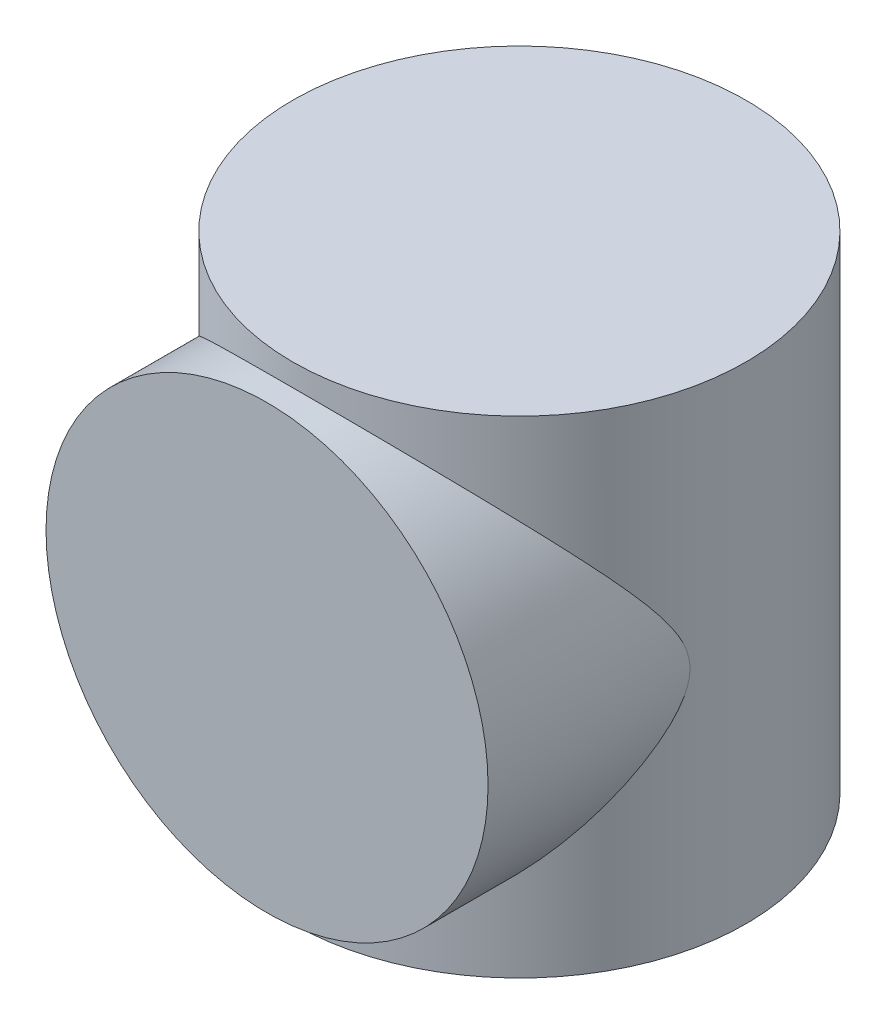
ISO-10303-21;
HEADER;
FILE_DESCRIPTION(('STEP AP214'),'2;1');
FILE_NAME('part.step','',(''),(''),'','','');
FILE_SCHEMA(('AUTOMOTIVE_DESIGN { 1 0 10303 214 1 1 1 1 }'));
ENDSEC;
DATA;
#1=APPLICATION_CONTEXT('core data for automotive mechanical design processes');
#2=APPLICATION_PROTOCOL_DEFINITION('international standard','automotive_design',2000,#1);
#3=PRODUCT_CONTEXT('',#1,'mechanical');
#4=PRODUCT('Part','Part','',(#3));
#5=PRODUCT_RELATED_PRODUCT_CATEGORY('part','',(#4));
#6=PRODUCT_DEFINITION_FORMATION('','',#4);
#7=PRODUCT_DEFINITION_CONTEXT('part definition',#1,'design');
#8=PRODUCT_DEFINITION('design','',#6,#7);
#9=PRODUCT_DEFINITION_SHAPE('','',#8);
#10=(LENGTH_UNIT() NAMED_UNIT(*) SI_UNIT(.MILLI.,.METRE.));
#11=(NAMED_UNIT(*) PLANE_ANGLE_UNIT() SI_UNIT($,.RADIAN.));
#12=(NAMED_UNIT(*) SI_UNIT($,.STERADIAN.) SOLID_ANGLE_UNIT());
#13=UNCERTAINTY_MEASURE_WITH_UNIT(LENGTH_MEASURE(1.E-05),#10,'distance_accuracy_value','');
#14=(GEOMETRIC_REPRESENTATION_CONTEXT(3) GLOBAL_UNCERTAINTY_ASSIGNED_CONTEXT((#13)) GLOBAL_UNIT_ASSIGNED_CONTEXT((#10,
#11,#12)) REPRESENTATION_CONTEXT('',''));
#15=CARTESIAN_POINT('',(0.,0.,0.));
#16=DIRECTION('',(0.,0.,1.));
#17=DIRECTION('',(1.,0.,0.));
#18=AXIS2_PLACEMENT_3D('',#15,#16,#17);
#19=CARTESIAN_POINT('',(0.,115.7,0.));
#20=DIRECTION('',(0.,-1.,0.));
#21=DIRECTION('',(0.,0.,-1.));
#22=AXIS2_PLACEMENT_3D('',#19,#20,#21);
#23=CYLINDRICAL_SURFACE('',#22,53.9);
#24=CARTESIAN_POINT('',(0.,115.7,0.));
#25=DIRECTION('',(0.,1.,0.));
#26=DIRECTION('',(0.,0.,1.));
#27=AXIS2_PLACEMENT_3D('',#24,#25,#26);
#28=CIRCLE('',#27,53.9);
#29=CARTESIAN_POINT('',(0.,115.7,53.9));
#30=VERTEX_POINT('',#29);
#31=EDGE_CURVE('E49',#30,#30,#28,.T.);
#32=ORIENTED_EDGE('',*,*,#31,.F.);
#33=EDGE_LOOP('',(#32));
#34=FACE_BOUND('',#33,.T.);
#35=CARTESIAN_POINT('',(0.,0.,0.));
#36=DIRECTION('',(0.,1.,0.));
#37=DIRECTION('',(0.,0.,1.));
#38=AXIS2_PLACEMENT_3D('',#35,#36,#37);
#39=CIRCLE('',#38,53.9);
#40=CARTESIAN_POINT('',(0.,0.,53.9));
#41=VERTEX_POINT('',#40);
#42=EDGE_CURVE('E54',#41,#41,#39,.T.);
#43=ORIENTED_EDGE('',*,*,#42,.T.);
#44=EDGE_LOOP('',(#43));
#45=FACE_BOUND('',#44,.T.);
#46=CARTESIAN_POINT('',(-52.55,57.85,11.9878063047414));
#47=CARTESIAN_POINT('',(-52.5500013049718,57.4353326704794,11.9877970546293));
#48=CARTESIAN_POINT('',(-52.5450742041005,57.0206930212394,12.0094597837771));
#49=CARTESIAN_POINT('',(-52.5255831345348,56.1959692170633,12.0944188754141));
#50=CARTESIAN_POINT('',(-52.5110181552478,55.7858855444357,12.1577196039075));
#51=CARTESIAN_POINT('',(-52.4726958568226,54.9714634137948,12.3220637154925));
#52=CARTESIAN_POINT('',(-52.4488857718169,54.5671720037319,12.4233236315369));
#53=CARTESIAN_POINT('',(-52.3927990985339,53.7686502685866,12.6577671313837));
#54=CARTESIAN_POINT('',(-52.3605212995449,53.3744213910944,12.7909552800424));
#55=CARTESIAN_POINT('',(-52.2875196252863,52.589173282455,13.0862071888048));
#56=CARTESIAN_POINT('',(-52.2466459621767,52.1983597903172,13.2487746862278));
#57=CARTESIAN_POINT('',(-52.1574702305448,51.4272656061719,13.5956012993441));
#58=CARTESIAN_POINT('',(-52.1091651708133,51.0469892285155,13.7798691426024));
#59=CARTESIAN_POINT('',(-52.0055770514227,50.295766874501,14.1658005041761));
#60=CARTESIAN_POINT('',(-51.9502848447022,49.9248339074463,14.367486713743));
#61=CARTESIAN_POINT('',(-51.8331454731376,49.1917529503745,14.7845216485642));
#62=CARTESIAN_POINT('',(-51.7712970647888,48.829606642974,14.9998729625378));
#63=CARTESIAN_POINT('',(-51.5755906574373,47.7505791747779,15.6646684476805));
#64=CARTESIAN_POINT('',(-51.4321906297022,47.0455251748653,16.1305017808021));
#65=CARTESIAN_POINT('',(-51.1216598545446,45.6606114747183,17.0891874092062));
#66=CARTESIAN_POINT('',(-50.954546934812,44.980733326775,17.5820192372822));
#67=CARTESIAN_POINT('',(-50.655340425748,43.8586630918849,18.422155284591));
#68=CARTESIAN_POINT('',(-50.5295514448285,43.4111311878413,18.7646184440778));
#69=CARTESIAN_POINT('',(-50.2675444883191,42.5238650081251,19.4556046252069));
#70=CARTESIAN_POINT('',(-50.1313262631433,42.0841309193749,19.804127791719));
#71=CARTESIAN_POINT('',(-49.7070547013632,40.7750574014817,20.8564193406821));
#72=CARTESIAN_POINT('',(-49.4034296684526,39.9160152770378,21.5667817031769));
#73=CARTESIAN_POINT('',(-48.7543322110036,38.2198557885142,22.9965864983582));
#74=CARTESIAN_POINT('',(-48.4088105121394,37.3827656765447,23.7160387134713));
#75=CARTESIAN_POINT('',(-47.6758599769468,35.7291362556103,25.1570223426915));
#76=CARTESIAN_POINT('',(-47.2884356812158,34.912594731781,25.8785535232895));
#77=CARTESIAN_POINT('',(-46.4721789264728,33.3010161120078,27.3171902213021));
#78=CARTESIAN_POINT('',(-46.0434614620432,32.5059267620602,28.0343024324743));
#79=CARTESIAN_POINT('',(-45.1430015301863,30.9347298916447,29.4623841416786));
#80=CARTESIAN_POINT('',(-44.6712572465603,30.1586231742051,30.1733533790226));
#81=CARTESIAN_POINT('',(-43.6842925186995,28.6264681794479,31.5853450046613));
#82=CARTESIAN_POINT('',(-43.1691042663715,27.8704055861238,32.2863743161951));
#83=CARTESIAN_POINT('',(-42.0941404270295,26.3788897444873,33.6758808328279));
#84=CARTESIAN_POINT('',(-41.5343682631877,25.6434349197514,34.364358996631));
#85=CARTESIAN_POINT('',(-40.0975763132204,23.8566883054026,36.0433117152118));
#86=CARTESIAN_POINT('',(-39.1943130232432,22.8179899949603,37.0249496186175));
#87=CARTESIAN_POINT('',(-37.2869368711072,20.7943660240229,38.9451656563462));
#88=CARTESIAN_POINT('',(-36.2828175902473,19.8094437921231,39.8837410445295));
#89=CARTESIAN_POINT('',(-34.1726462614439,17.903136602626,41.7058882988039));
#90=CARTESIAN_POINT('',(-33.0667231124419,16.9816738126409,42.5895274094372));
#91=CARTESIAN_POINT('',(-30.7506065262769,15.2116890952319,44.2907835843926));
#92=CARTESIAN_POINT('',(-29.5404425107421,14.3631467204665,45.1084191525964));
#93=CARTESIAN_POINT('',(-27.3130576127681,12.9410768975817,46.4811041380097));
#94=CARTESIAN_POINT('',(-26.317336383415,12.3497849826128,47.0527041439046));
#95=CARTESIAN_POINT('',(-24.2663796204081,11.2236842275723,48.1425041145453));
#96=CARTESIAN_POINT('',(-23.2111506600976,10.6888691676286,48.660709959509));
#97=CARTESIAN_POINT('',(-21.0440636104702,9.68282438633874,49.6363704135245));
#98=CARTESIAN_POINT('',(-19.9322193043593,9.21157928964556,50.0938397121946));
#99=CARTESIAN_POINT('',(-17.6556720076965,8.33975578472478,50.9407604339118));
#100=CARTESIAN_POINT('',(-16.4909682651995,7.9391783821679,51.3302108889831));
#101=CARTESIAN_POINT('',(-14.7036506434412,7.39508069785741,51.8594697722547));
#102=CARTESIAN_POINT('',(-14.0979883063945,7.22244681291753,52.0274471496918));
#103=CARTESIAN_POINT('',(-12.8759708039646,6.89795124863881,52.3432648818633));
#104=CARTESIAN_POINT('',(-12.2596170136799,6.74608691998677,52.4911078048886));
#105=CARTESIAN_POINT('',(-11.0172664464862,6.46392968448306,52.7658477677308));
#106=CARTESIAN_POINT('',(-10.391268098352,6.33364033397916,52.8927413543184));
#107=CARTESIAN_POINT('',(-9.1311198150306,6.09542295014088,53.1247872443779));
#108=CARTESIAN_POINT('',(-8.49697101114599,5.98749184827923,53.2299425312889));
#109=CARTESIAN_POINT('',(-7.22238139406605,5.79469466325379,53.4178045627013));
#110=CARTESIAN_POINT('',(-6.5819458165595,5.70981083722859,53.5005285757722));
#111=CARTESIAN_POINT('',(-5.29595134842899,5.56353758884728,53.6430926013268));
#112=CARTESIAN_POINT('',(-4.65039316700607,5.50214497023066,53.7029357270289));
#113=CARTESIAN_POINT('',(-3.35574786588368,5.40323825114148,53.7993512522716));
#114=CARTESIAN_POINT('',(-2.70666099383822,5.36572249619371,53.8359252641751));
#115=CARTESIAN_POINT('',(-1.40671678374212,5.31480253254148,53.8855680565164));
#116=CARTESIAN_POINT('',(-0.75585952177808,5.30139730353025,53.8986378316039));
#117=CARTESIAN_POINT('',(0.998968558011375,5.29791276014159,53.9020347285166));
#118=CARTESIAN_POINT('',(2.1031916570227,5.33054613747638,53.870217211272));
#119=CARTESIAN_POINT('',(4.30311082436048,5.46488156759277,53.7392586186031));
#120=CARTESIAN_POINT('',(5.39880792438515,5.56657512795435,53.640125821026));
#121=CARTESIAN_POINT('',(7.5739213353875,5.83712438259939,53.3764537161208));
#122=CARTESIAN_POINT('',(8.65333722050091,6.00598183052332,53.2119127009927));
#123=CARTESIAN_POINT('',(10.7885925247834,6.40790406016866,52.8204001465599));
#124=CARTESIAN_POINT('',(11.8444309732592,6.6409714801932,52.5934260419626));
#125=CARTESIAN_POINT('',(13.9069858729734,7.16263545565783,52.0856306892344));
#126=CARTESIAN_POINT('',(14.9142500983666,7.45012253391852,51.8058856440182));
#127=CARTESIAN_POINT('',(16.895285827336,8.07920598892373,51.194082434543));
#128=CARTESIAN_POINT('',(17.8690589367477,8.4207997669397,50.862026782751));
#129=CARTESIAN_POINT('',(19.7796004531245,9.15382917038116,50.1499450136079));
#130=CARTESIAN_POINT('',(20.7163652499546,9.54526964266425,49.7699142314124));
#131=CARTESIAN_POINT('',(22.5503931066533,10.3737425707565,48.9662373108216));
#132=CARTESIAN_POINT('',(23.4476477712364,10.8107846503536,48.5425819661237));
#133=CARTESIAN_POINT('',(24.9686175034152,11.6050064309012,47.7734225153539));
#134=CARTESIAN_POINT('',(25.6018862283103,11.9527150441688,47.436904875915));
#135=CARTESIAN_POINT('',(26.845434915774,12.6688105241155,46.7444016811932));
#136=CARTESIAN_POINT('',(27.4557190003914,13.0371936532484,46.3884196449884));
#137=CARTESIAN_POINT('',(29.2523153341275,14.1715050130043,45.2932611098568));
#138=CARTESIAN_POINT('',(30.4041089537426,14.9664569443011,44.5270061957125));
#139=CARTESIAN_POINT('',(32.616976343401,16.6243709949886,42.9326006196445));
#140=CARTESIAN_POINT('',(33.6778205837058,17.4874952021313,42.1043026999425));
#141=CARTESIAN_POINT('',(35.7069885288822,19.2710184651611,40.3977473622186));
#142=CARTESIAN_POINT('',(36.6753135317273,20.1914167172384,39.5194906453557));
#143=CARTESIAN_POINT('',(38.2316230086412,21.7852318671674,38.0044021838038));
#144=CARTESIAN_POINT('',(38.8436393332928,22.4455665931608,37.3782494843246));
#145=CARTESIAN_POINT('',(40.0258060950094,23.7877465862464,36.1095085289734));
#146=CARTESIAN_POINT('',(40.595953249182,24.4695935340967,35.4669189896309));
#147=CARTESIAN_POINT('',(41.6953171043016,25.8533705574664,34.1677478356447));
#148=CARTESIAN_POINT('',(42.2245155194733,26.5553094155989,33.5111601351137));
#149=CARTESIAN_POINT('',(43.2424865750067,27.9776933311149,32.1868729632157));
#150=CARTESIAN_POINT('',(43.7312603799322,28.6981378545977,31.5191738126167));
#151=CARTESIAN_POINT('',(44.6684271555844,30.155532049922,30.1763304429081));
#152=CARTESIAN_POINT('',(45.1168818318154,30.8924542682887,29.5011994387176));
#153=CARTESIAN_POINT('',(45.9749856810165,32.3834894881297,28.1452373377347));
#154=CARTESIAN_POINT('',(46.384633417742,33.1376031245779,27.4644060309883));
#155=CARTESIAN_POINT('',(47.1655234226268,34.662729284886,26.1005839844685));
#156=CARTESIAN_POINT('',(47.5367855415983,35.4337328217249,25.4175945509978));
#157=CARTESIAN_POINT('',(48.2416254640252,36.9938049726455,24.0529622024221));
#158=CARTESIAN_POINT('',(48.5752073813617,37.7828716032843,23.3713191483205));
#159=CARTESIAN_POINT('',(49.1314568047526,39.1942906923242,22.1729258118413));
#160=CARTESIAN_POINT('',(49.3618262489028,39.8125090443086,21.6548683347114));
#161=CARTESIAN_POINT('',(49.8007045861991,41.0621771962577,20.6255346732656));
#162=CARTESIAN_POINT('',(50.0092148465442,41.6936261657361,20.1142580665844));
#163=CARTESIAN_POINT('',(50.4046398875373,42.9730404817886,19.1017817388861));
#164=CARTESIAN_POINT('',(50.5915181995439,43.621031535011,18.6006001784513));
#165=CARTESIAN_POINT('',(50.9429752937575,44.9357072204165,17.6152338057218));
#166=CARTESIAN_POINT('',(51.1075571147524,45.6023892902233,17.1310466839339));
#167=CARTESIAN_POINT('',(51.3838797491542,46.8267301016682,16.2808470117423));
#168=CARTESIAN_POINT('',(51.4996632198129,47.3802564620479,15.9102209969458));
#169=CARTESIAN_POINT('',(51.7157937232632,48.5061257886157,15.1929854011839));
#170=CARTESIAN_POINT('',(51.8161339814693,49.0784768799194,14.846386396754));
#171=CARTESIAN_POINT('',(51.9999604037292,50.2438386450336,14.1890841248994));
#172=CARTESIAN_POINT('',(52.0834990809077,50.836777935735,13.8782703557073));
#173=CARTESIAN_POINT('',(52.2323507009157,52.0486410706829,13.3070838732605));
#174=CARTESIAN_POINT('',(52.2976846921262,52.6675339462515,13.046653014392));
#175=CARTESIAN_POINT('',(52.3827014920632,53.6457852643363,12.6995574302128));
#176=CARTESIAN_POINT('',(52.4096501993148,53.9955557430109,12.5876513724749));
#177=CARTESIAN_POINT('',(52.4568599577211,54.7026553731284,12.389439081846));
#178=CARTESIAN_POINT('',(52.4771241626969,55.0599808751046,12.3031207783269));
#179=CARTESIAN_POINT('',(52.510438771083,55.7798102030883,12.1601502396148));
#180=CARTESIAN_POINT('',(52.5235107328829,56.142295175534,12.1034093747131));
#181=CARTESIAN_POINT('',(52.5421454809526,56.8710927632422,12.0222592082969));
#182=CARTESIAN_POINT('',(52.5477088324814,57.2374050882836,11.9978474730011));
#183=CARTESIAN_POINT('',(52.5511491925812,57.9726508432133,11.9827705747412));
#184=CARTESIAN_POINT('',(52.5489867020582,58.3415880906205,11.9922788305575));
#185=CARTESIAN_POINT('',(52.5369626954393,59.0769110315673,12.0448432852695));
#186=CARTESIAN_POINT('',(52.5271008071114,59.4432966008805,12.087901106138));
#187=CARTESIAN_POINT('',(52.4999600596109,60.1716091156536,12.2052354852232));
#188=CARTESIAN_POINT('',(52.4826629289992,60.533522803087,12.2795889402103));
#189=CARTESIAN_POINT('',(52.4411092986286,61.2502278196861,12.4558516591349));
#190=CARTESIAN_POINT('',(52.4168495689499,61.605015761329,12.5577737107598));
#191=CARTESIAN_POINT('',(52.3450034263502,62.5217749381416,12.8548048208673));
#192=CARTESIAN_POINT('',(52.2922391456389,63.0772421661603,13.0687119634492));
#193=CARTESIAN_POINT('',(52.1718231209788,64.1670072983746,13.5414307397811));
#194=CARTESIAN_POINT('',(52.1041588771199,64.7012869810953,13.8002800377031));
#195=CARTESIAN_POINT('',(51.9550582793523,65.7530116776779,14.3514397448447));
#196=CARTESIAN_POINT('',(51.8735649780917,66.2703760795304,14.6438868309092));
#197=CARTESIAN_POINT('',(51.6979908851865,67.288594105861,15.2521466188171));
#198=CARTESIAN_POINT('',(51.6039140415492,67.7894528477049,15.567951978313));
#199=CARTESIAN_POINT('',(51.4194246879002,68.7001583351415,16.1658542448787));
#200=CARTESIAN_POINT('',(51.3307420995931,69.1119832481199,16.4454936702797));
#201=CARTESIAN_POINT('',(51.1450687858876,69.9272151821952,17.0141564089255));
#202=CARTESIAN_POINT('',(51.0480774022045,70.3306215331561,17.303180464562));
#203=CARTESIAN_POINT('',(50.7448145049136,71.5301932623794,18.1812143108215));
#204=CARTESIAN_POINT('',(50.5263152754464,72.315413017542,18.7809854450813));
#205=CARTESIAN_POINT('',(50.057029915189,73.8640992813449,19.9982702754309));
#206=CARTESIAN_POINT('',(49.8061909687461,74.6275276535916,20.6158116823411));
#207=CARTESIAN_POINT('',(49.2726815553929,76.1350880420487,21.8602641644036));
#208=CARTESIAN_POINT('',(48.9900174901379,76.87922390205,22.4871733332954));
#209=CARTESIAN_POINT('',(48.3919589192441,78.3525440033544,23.7469123009135));
#210=CARTESIAN_POINT('',(48.076485816116,79.0816870844437,24.3797528516604));
#211=CARTESIAN_POINT('',(47.4130666348347,80.524524010964,25.6460941954358));
#212=CARTESIAN_POINT('',(47.0651191499185,81.2382171854666,26.27959501589));
#213=CARTESIAN_POINT('',(46.3366494373453,82.6501592688426,27.5437235833832));
#214=CARTESIAN_POINT('',(45.956154635992,83.3484205691073,28.1743532868587));
#215=CARTESIAN_POINT('',(45.1618465455091,84.7301996942129,29.4307668040652));
#216=CARTESIAN_POINT('',(44.7480333987619,85.4137175820423,30.056550638492));
#217=CARTESIAN_POINT('',(43.8589324784985,86.8090055820781,31.3409081843791));
#218=CARTESIAN_POINT('',(43.3814048764968,87.5197811366208,31.9990148326392));
#219=CARTESIAN_POINT('',(42.3872629610003,88.9234951775667,33.3047034182068));
#220=CARTESIAN_POINT('',(41.8706480271525,89.6164333806403,33.9522851882763));
#221=CARTESIAN_POINT('',(40.7973206830199,90.9836201593793,35.2347580316459));
#222=CARTESIAN_POINT('',(40.2405886470251,91.6578593608534,35.8696426966891));
#223=CARTESIAN_POINT('',(39.0865158893554,92.9857443009535,37.123853492188));
#224=CARTESIAN_POINT('',(38.4891762787417,93.6393906023048,37.7431800476937));
#225=CARTESIAN_POINT('',(37.255471475248,94.9218360408575,38.9613722763331));
#226=CARTESIAN_POINT('',(36.6192608102517,95.5507190629962,39.5603058891737));
#227=CARTESIAN_POINT('',(35.3051497072891,96.7840587582049,40.7373850596128));
#228=CARTESIAN_POINT('',(34.6272474749344,97.3885143780713,41.3155297207636));
#229=CARTESIAN_POINT('',(33.2297919283618,98.5700191495806,42.447601810742));
#230=CARTESIAN_POINT('',(32.5102698673499,99.1470882884168,43.0015468766912));
#231=CARTESIAN_POINT('',(31.0288838489451,100.271403963991,44.082412294992));
#232=CARTESIAN_POINT('',(30.2670212214199,100.818651436325,44.6093334951332));
#233=CARTESIAN_POINT('',(28.5418813818127,101.987948775319,45.7366070613954));
#234=CARTESIAN_POINT('',(27.5691103336169,102.602635111062,46.3301550176611));
#235=CARTESIAN_POINT('',(25.5632061266785,103.777941352022,47.4664171354372));
#236=CARTESIAN_POINT('',(24.5300835341613,104.338570676143,48.00914015222));
#237=CARTESIAN_POINT('',(22.4055320436562,105.398964331681,49.0366634167432));
#238=CARTESIAN_POINT('',(21.3141123562149,105.89873823716,49.5214727755072));
#239=CARTESIAN_POINT('',(19.0761109593841,106.830328853315,50.4258626589511));
#240=CARTESIAN_POINT('',(17.9295273562424,107.262143228793,50.8454409421825));
#241=CARTESIAN_POINT('',(16.1670382369465,107.855193977684,51.422026137913));
#242=CARTESIAN_POINT('',(15.5692635143208,108.044593642307,51.6062303570801));
#243=CARTESIAN_POINT('',(14.362108001353,108.40322518889,51.9551186069262));
#244=CARTESIAN_POINT('',(13.752728662251,108.572459573702,52.119805060075));
#245=CARTESIAN_POINT('',(12.5233091526701,108.889909879739,52.4287952977431));
#246=CARTESIAN_POINT('',(11.9032673047109,109.038122459153,52.5730958415228));
#247=CARTESIAN_POINT('',(10.653904483406,109.312664196073,52.8404421929092));
#248=CARTESIAN_POINT('',(10.0245847770628,109.438996312124,52.9634908740582));
#249=CARTESIAN_POINT('',(8.75845437480551,109.668969727779,53.1875215587464));
#250=CARTESIAN_POINT('',(8.12165014827262,109.772629294417,53.2885213267376));
#251=CARTESIAN_POINT('',(6.84162310388298,109.956743738323,53.4679325933186));
#252=CARTESIAN_POINT('',(6.19840116884935,110.037201762889,53.5463471555981));
#253=CARTESIAN_POINT('',(4.90707193526063,110.174417051268,53.6800883309749));
#254=CARTESIAN_POINT('',(4.25896496292956,110.231175883692,53.7354164721235));
#255=CARTESIAN_POINT('',(2.95959199611,110.320635905186,53.8226256977206));
#256=CARTESIAN_POINT('',(2.30832613057037,110.35333806809,53.8545077312857));
#257=CARTESIAN_POINT('',(0.538125650079869,110.409138840785,53.9089091652975));
#258=CARTESIAN_POINT('',(-0.582437365720675,110.408675688309,53.9084577565219));
#259=CARTESIAN_POINT('',(-2.81876790977956,110.336275654206,53.8378730513043));
#260=CARTESIAN_POINT('',(-3.9345359588625,110.264346742831,53.7677475253008));
#261=CARTESIAN_POINT('',(-6.1528746246024,110.050442594189,53.5592488363999));
#262=CARTESIAN_POINT('',(-7.25544536822854,109.908468031376,53.4208763306375));
#263=CARTESIAN_POINT('',(-9.43940475565062,109.557094557347,53.0785226317714));
#264=CARTESIAN_POINT('',(-10.5207928460753,109.347693887192,52.8745397270938));
#265=CARTESIAN_POINT('',(-12.6133962014195,108.874601872602,52.4138790225922));
#266=CARTESIAN_POINT('',(-13.625698623407,108.613369673431,52.1595892260934));
#267=CARTESIAN_POINT('',(-15.6191772553606,108.03586130349,51.5977104440105));
#268=CARTESIAN_POINT('',(-16.600355425505,107.719588607291,51.290124822867));
#269=CARTESIAN_POINT('',(-18.5277067450154,107.036099005595,50.6258172480088));
#270=CARTESIAN_POINT('',(-19.4738764579765,106.668877115678,50.2690904867824));
#271=CARTESIAN_POINT('',(-21.3283582539369,105.887654117737,49.5107553868612));
#272=CARTESIAN_POINT('',(-22.2366624037146,105.473643273705,49.1091377072995));
#273=CARTESIAN_POINT('',(-23.7650783021964,104.724642156177,48.38319558166));
#274=CARTESIAN_POINT('',(-24.3948694823582,104.399848110459,48.0685840497289));
#275=CARTESIAN_POINT('',(-25.632938926965,103.729737984914,47.4199408407463));
#276=CARTESIAN_POINT('',(-26.2412212087569,103.384425770028,47.0859128213736));
#277=CARTESIAN_POINT('',(-28.0338763334087,102.319500651144,46.0566037667629));
#278=CARTESIAN_POINT('',(-29.1858200736329,101.571016519644,45.3342114527438));
#279=CARTESIAN_POINT('',(-31.4037647428613,100.006292620092,43.8271155024704));
#280=CARTESIAN_POINT('',(-32.4695668876033,99.1899044869881,43.0422755943));
#281=CARTESIAN_POINT('',(-34.5130299849274,97.4998585464569,41.4217505720769));
#282=CARTESIAN_POINT('',(-35.4906909275494,96.6262007325579,40.5860654522787));
#283=CARTESIAN_POINT('',(-37.7086750494126,94.4932769211069,38.5525258422913));
#284=CARTESIAN_POINT('',(-38.9107545615085,93.2118418664997,37.335959814518));
#285=CARTESIAN_POINT('',(-40.5951788525682,91.2309173927259,35.4675279293369));
#286=CARTESIAN_POINT('',(-41.1370422809907,90.5605656461527,34.8372221264471));
#287=CARTESIAN_POINT('',(-42.1820219784687,89.2014631301174,33.5643387544464));
#288=CARTESIAN_POINT('',(-42.6851392936283,88.5127128580727,32.9217615172364));
#289=CARTESIAN_POINT('',(-43.6528264910762,87.1186283972021,31.6274109377889));
#290=CARTESIAN_POINT('',(-44.1174325819366,86.4133106049596,30.9756469235758));
#291=CARTESIAN_POINT('',(-45.0093531758724,84.9861154287357,29.6647361596375));
#292=CARTESIAN_POINT('',(-45.4366665962503,84.2642375647427,29.0055891961936));
#293=CARTESIAN_POINT('',(-46.2544344726847,82.8045465833848,27.68287510573));
#294=CARTESIAN_POINT('',(-46.6449050832064,82.0667406260298,27.0193100538317));
#295=CARTESIAN_POINT('',(-47.3897276716892,80.5746892913687,25.6905357318364));
#296=CARTESIAN_POINT('',(-47.7440827381818,79.8204453265165,25.025326607329));
#297=CARTESIAN_POINT('',(-48.3807007415211,78.3771329873678,23.7688585170263));
#298=CARTESIAN_POINT('',(-48.6666150709794,77.6898524027596,23.1773928148743));
#299=CARTESIAN_POINT('',(-49.2102988501871,76.3000904190816,21.9994787164618));
#300=CARTESIAN_POINT('',(-49.4680702848853,75.5976100962587,21.4130299690423));
#301=CARTESIAN_POINT('',(-49.9557127802071,74.1746860022179,20.2493194735872));
#302=CARTESIAN_POINT('',(-50.185564967,73.4542304717462,19.6720641670032));
#303=CARTESIAN_POINT('',(-50.6169718708371,71.9923418844399,18.5338066805346));
#304=CARTESIAN_POINT('',(-50.8185305540667,71.2509117853651,17.9728022313714));
#305=CARTESIAN_POINT('',(-51.1475910702906,69.9236925145229,17.0096134465888));
#306=CARTESIAN_POINT('',(-51.2812242284952,69.3435409599225,16.6017836966402));
#307=CARTESIAN_POINT('',(-51.5313681919898,68.1642750715849,15.8082585716354));
#308=CARTESIAN_POINT('',(-51.6478727754086,67.5651539428129,15.4225712705703));
#309=CARTESIAN_POINT('',(-51.8626888195099,66.3440096382773,14.6839668727632));
#310=CARTESIAN_POINT('',(-51.9610125332009,65.7220022282016,14.3310277858494));
#311=CARTESIAN_POINT('',(-52.0935921516638,64.7682967211697,13.8382394823774));
#312=CARTESIAN_POINT('',(-52.1352884240021,64.4470678626978,13.6801315697084));
#313=CARTESIAN_POINT('',(-52.2134450806676,63.7969273555902,13.3787267945154));
#314=CARTESIAN_POINT('',(-52.2499035553122,63.4680129553925,13.2354353393292));
#315=CARTESIAN_POINT('',(-52.3260583849464,62.7146352497023,12.9315191872925));
#316=CARTESIAN_POINT('',(-52.3640828386509,62.2878013678753,12.7762532466641));
#317=CARTESIAN_POINT('',(-52.4302509457368,61.422043012106,12.5019509347385));
#318=CARTESIAN_POINT('',(-52.4584017242329,60.9831275042965,12.3828884463288));
#319=CARTESIAN_POINT('',(-52.5037494497098,60.098027831433,12.1891855336875));
#320=CARTESIAN_POINT('',(-52.5210208762701,59.6519150178089,12.1142433004991));
#321=CARTESIAN_POINT('',(-52.5441436817881,58.7538559509981,12.0135663037681));
#322=CARTESIAN_POINT('',(-52.5499985778194,58.3019115375469,11.9878163856716));
#323=CARTESIAN_POINT('',(-52.55,57.85,11.9878063047414));
#324=B_SPLINE_CURVE_WITH_KNOTS('',3,(#46,#47,#48,#49,#50,#51,#52,#53,#54,#55,#56,#57,#58,#59,
#60,#61,#62,#63,#64,#65,#66,#67,#68,#69,#70,#71,#72,#73,#74,#75,#76,#77,#78,#79,#80,#81,#82,#83,
#84,#85,#86,#87,#88,#89,#90,#91,#92,#93,#94,#95,#96,#97,#98,#99,#100,#101,#102,#103,#104,#105,
#106,#107,#108,#109,#110,#111,#112,#113,#114,#115,#116,#117,#118,#119,#120,#121,#122,#123,#124,
#125,#126,#127,#128,#129,#130,#131,#132,#133,#134,#135,#136,#137,#138,#139,#140,#141,#142,#143,
#144,#145,#146,#147,#148,#149,#150,#151,#152,#153,#154,#155,#156,#157,#158,#159,#160,#161,#162,
#163,#164,#165,#166,#167,#168,#169,#170,#171,#172,#173,#174,#175,#176,#177,#178,#179,#180,#181,
#182,#183,#184,#185,#186,#187,#188,#189,#190,#191,#192,#193,#194,#195,#196,#197,#198,#199,#200,
#201,#202,#203,#204,#205,#206,#207,#208,#209,#210,#211,#212,#213,#214,#215,#216,#217,#218,#219,
#220,#221,#222,#223,#224,#225,#226,#227,#228,#229,#230,#231,#232,#233,#234,#235,#236,#237,#238,
#239,#240,#241,#242,#243,#244,#245,#246,#247,#248,#249,#250,#251,#252,#253,#254,#255,#256,#257,
#258,#259,#260,#261,#262,#263,#264,#265,#266,#267,#268,#269,#270,#271,#272,#273,#274,#275,#276,
#277,#278,#279,#280,#281,#282,#283,#284,#285,#286,#287,#288,#289,#290,#291,#292,#293,#294,#295,
#296,#297,#298,#299,#300,#301,#302,#303,#304,#305,#306,#307,#308,#309,#310,#311,#312,#313,#314,
#315,#316,#317,#318,#319,#320,#321,#322,#323),.UNSPECIFIED.,.T.,.F.,(4,2,2,2,2,2,2,2,2,2,2,2,2,
2,2,2,2,2,2,2,2,2,2,2,2,2,2,2,2,2,2,2,2,2,2,2,2,2,2,2,2,2,2,2,2,2,2,2,2,2,2,2,2,2,2,2,2,2,2,2,2,
2,2,2,2,2,2,2,2,2,2,2,2,2,2,2,2,2,2,2,2,2,2,2,2,2,2,2,2,2,2,2,2,2,2,2,2,2,2,2,2,2,2,2,2,2,2,2,2,
2,2,2,2,2,2,2,2,2,2,2,2,2,2,2,2,2,2,2,2,2,2,2,2,2,2,2,2,2,4),(0.,1.24338888058272,
2.48690815903627,3.73763161689676,4.98853400045989,6.26337077552107,7.53872203384256,
8.81576052928298,10.093041673517,12.6626910809806,15.2304187256472,16.9624295221993,
18.6944817810694,22.1592350333169,25.6281034135856,29.0965962805154,32.5556948590308,
36.0149395166869,39.4716430329161,42.9280813973199,47.995828403355,53.0638981367628,
58.1256369539197,63.185951764735,67.0569582118645,70.9275378942503,74.7971797340715,
78.6668766382566,80.6216786894062,82.5762311578145,84.5311054881414,86.4857113464029,
88.4388081642484,90.3916391452725,92.3443347960321,94.2969478108737,97.607842163888,
100.91832944565,104.228903169483,107.53961294072,110.788949666087,114.038130374082,
117.287627258681,120.537811311255,122.927911325938,125.317580640671,130.097892904763,
134.889934417922,139.681908692569,142.970844290348,146.260037493393,149.550691118662,
152.841249912802,156.126683828817,159.412239291253,162.696087066156,165.979575967096,
168.495716924133,171.011700413247,173.531865579588,176.05168692643,178.079453924267,
180.108107937331,182.130319364149,184.150182901816,185.254012037415,186.357319626971,
187.457301835671,188.557201231489,189.662731995454,190.768316210245,191.876632971689,
192.985464709844,194.774929413433,196.565901097095,198.364435299422,200.162406540763,
201.679048544642,203.195810819541,206.230427334539,209.270064150279,212.309090628637,
215.355572863583,218.402187130894,221.446258964263,224.49031778981,227.729351002864,
230.968435633221,234.209115759103,237.449707252601,240.678162777505,243.906757351221,
247.132958209444,250.359057793673,254.239987640002,258.120240045676,261.999881200703,
265.879655637218,267.839745681775,269.799592192167,271.759749908797,273.719642377451,
275.677949916642,277.635991685619,279.593903834563,281.55173672135,284.908623102642,
288.265135147634,291.621614874154,294.978182168023,298.202736531216,301.427087409955,
304.65175395349,307.877092736617,310.202223666372,312.526917998479,317.177167972081,
321.837859636349,326.498551827292,332.899634881602,336.102449856947,339.305178329319,
342.50486058233,345.704635699072,348.90300122652,352.101093006026,354.952835951858,
357.804377631052,360.657836391601,363.510894753795,365.675178730769,367.840246941192,
370.003850641472,371.084856979885,372.166256454568,373.532177101134,374.897110024095,
376.25259410917,377.607660546264),.UNSPECIFIED.);
#325=CARTESIAN_POINT('',(-52.55,57.85,11.9878063047414));
#326=VERTEX_POINT('',#325);
#327=EDGE_CURVE('E10',#326,#326,#324,.T.);
#328=ORIENTED_EDGE('',*,*,#327,.F.);
#329=EDGE_LOOP('',(#328));
#330=FACE_BOUND('',#329,.T.);
#331=ADVANCED_FACE('F37',(#34,#45,#330),#23,.T.);
#332=CARTESIAN_POINT('',(0.,115.7,0.));
#333=DIRECTION('',(0.,1.,0.));
#334=DIRECTION('',(0.,0.,1.));
#335=AXIS2_PLACEMENT_3D('',#332,#333,#334);
#336=PLANE('',#335);
#337=ORIENTED_EDGE('',*,*,#31,.T.);
#338=EDGE_LOOP('',(#337));
#339=FACE_BOUND('',#338,.T.);
#340=ADVANCED_FACE('F76',(#339),#336,.T.);
#341=CARTESIAN_POINT('',(0.,0.,0.));
#342=DIRECTION('',(0.,1.,0.));
#343=DIRECTION('',(0.,0.,1.));
#344=AXIS2_PLACEMENT_3D('',#341,#342,#343);
#345=PLANE('',#344);
#346=ORIENTED_EDGE('',*,*,#42,.F.);
#347=EDGE_LOOP('',(#346));
#348=FACE_BOUND('',#347,.T.);
#349=ADVANCED_FACE('F70',(#348),#345,.F.);
#350=CARTESIAN_POINT('',(0.,57.85,60.));
#351=DIRECTION('',(0.,0.,-1.));
#352=DIRECTION('',(-1.,0.,0.));
#353=AXIS2_PLACEMENT_3D('',#350,#351,#352);
#354=CYLINDRICAL_SURFACE('',#353,52.55);
#355=CARTESIAN_POINT('',(0.,57.85,60.));
#356=DIRECTION('',(0.,0.,1.));
#357=DIRECTION('',(1.,0.,0.));
#358=AXIS2_PLACEMENT_3D('',#355,#356,#357);
#359=CIRCLE('',#358,52.55);
#360=CARTESIAN_POINT('',(52.55,57.85,60.));
#361=VERTEX_POINT('',#360);
#362=EDGE_CURVE('E60',#361,#361,#359,.T.);
#363=ORIENTED_EDGE('',*,*,#362,.F.);
#364=EDGE_LOOP('',(#363));
#365=FACE_BOUND('',#364,.T.);
#366=ORIENTED_EDGE('',*,*,#327,.T.);
#367=EDGE_LOOP('',(#366));
#368=FACE_BOUND('',#367,.T.);
#369=ADVANCED_FACE('F68',(#365,#368),#354,.T.);
#370=CARTESIAN_POINT('',(0.,57.85,60.));
#371=DIRECTION('',(0.,0.,1.));
#372=DIRECTION('',(1.,0.,0.));
#373=AXIS2_PLACEMENT_3D('',#370,#371,#372);
#374=PLANE('',#373);
#375=ORIENTED_EDGE('',*,*,#362,.T.);
#376=EDGE_LOOP('',(#375));
#377=FACE_BOUND('',#376,.T.);
#378=ADVANCED_FACE('F66',(#377),#374,.T.);
#379=CLOSED_SHELL('',(#331,#340,#349,#369,#378));
#380=MANIFOLD_SOLID_BREP('B2',#379);
#381=ADVANCED_BREP_SHAPE_REPRESENTATION('',(#18,#380),#14);
#382=SHAPE_DEFINITION_REPRESENTATION(#9,#381);
ENDSEC;
END-ISO-10303-21;
